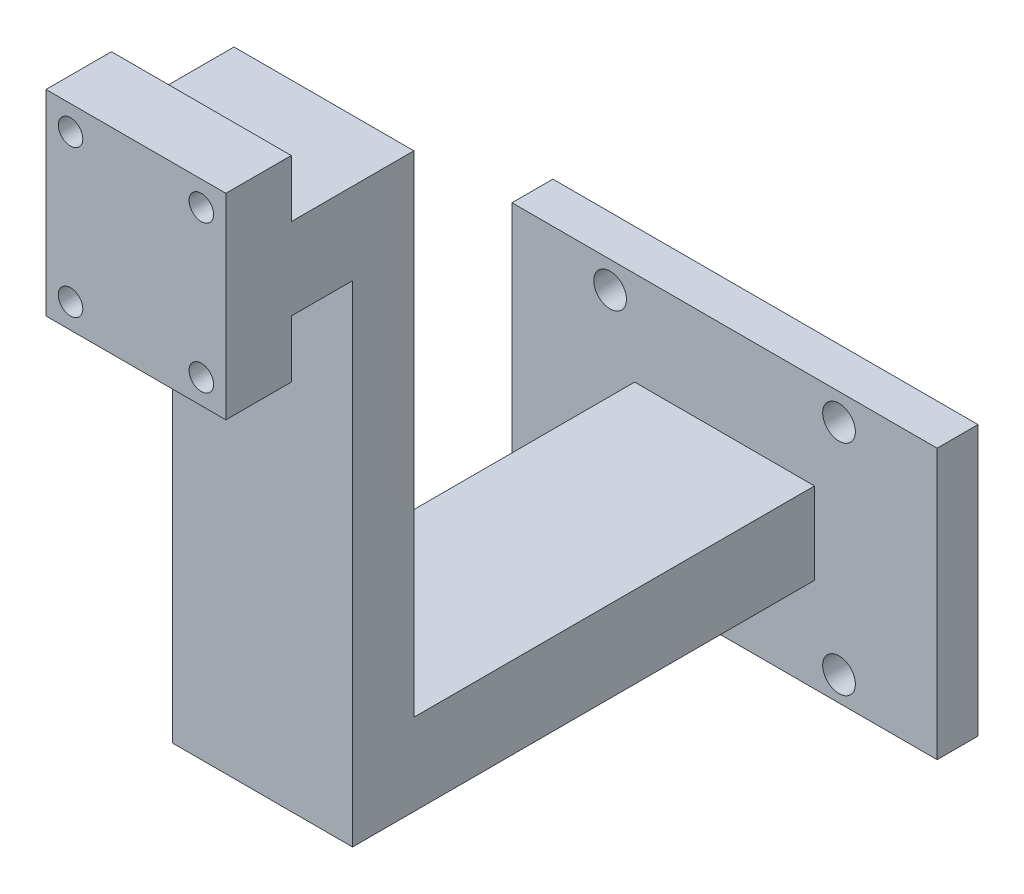
ISO-10303-21;
HEADER;
FILE_DESCRIPTION(('STEP AP214'),'2;1');
FILE_NAME('part.step','',(''),(''),'','','');
FILE_SCHEMA(('AUTOMOTIVE_DESIGN { 1 0 10303 214 1 1 1 1 }'));
ENDSEC;
DATA;
#1=APPLICATION_CONTEXT('core data for automotive mechanical design processes');
#2=APPLICATION_PROTOCOL_DEFINITION('international standard','automotive_design',2000,#1);
#3=PRODUCT_CONTEXT('',#1,'mechanical');
#4=PRODUCT('Part','Part','',(#3));
#5=PRODUCT_RELATED_PRODUCT_CATEGORY('part','',(#4));
#6=PRODUCT_DEFINITION_FORMATION('','',#4);
#7=PRODUCT_DEFINITION_CONTEXT('part definition',#1,'design');
#8=PRODUCT_DEFINITION('design','',#6,#7);
#9=PRODUCT_DEFINITION_SHAPE('','',#8);
#10=(LENGTH_UNIT() NAMED_UNIT(*) SI_UNIT(.MILLI.,.METRE.));
#11=(NAMED_UNIT(*) PLANE_ANGLE_UNIT() SI_UNIT($,.RADIAN.));
#12=(NAMED_UNIT(*) SI_UNIT($,.STERADIAN.) SOLID_ANGLE_UNIT());
#13=UNCERTAINTY_MEASURE_WITH_UNIT(LENGTH_MEASURE(1.E-05),#10,'distance_accuracy_value','');
#14=(GEOMETRIC_REPRESENTATION_CONTEXT(3) GLOBAL_UNCERTAINTY_ASSIGNED_CONTEXT((#13)) GLOBAL_UNIT_ASSIGNED_CONTEXT((#10,
#11,#12)) REPRESENTATION_CONTEXT('',''));
#15=CARTESIAN_POINT('',(0.,0.,0.));
#16=DIRECTION('',(0.,0.,1.));
#17=DIRECTION('',(1.,0.,0.));
#18=AXIS2_PLACEMENT_3D('',#15,#16,#17);
#19=CARTESIAN_POINT('',(0.,0.,8.));
#20=DIRECTION('',(-1.,0.,0.));
#21=DIRECTION('',(0.,0.,1.));
#22=AXIS2_PLACEMENT_3D('',#19,#20,#21);
#23=PLANE('',#22);
#24=DIRECTION('',(0.,0.,1.));
#25=VECTOR('',#24,1.);
#26=CARTESIAN_POINT('',(0.,-43.,-69.));
#27=LINE('',#26,#25);
#28=CARTESIAN_POINT('',(0.,-43.,-64.));
#29=VERTEX_POINT('',#28);
#30=CARTESIAN_POINT('',(0.,-43.,-15.));
#31=VERTEX_POINT('',#30);
#32=EDGE_CURVE('E209',#29,#31,#27,.T.);
#33=ORIENTED_EDGE('',*,*,#32,.F.);
#34=DIRECTION('',(0.,-1.,0.));
#35=VECTOR('',#34,1.);
#36=CARTESIAN_POINT('',(0.,0.,-64.));
#37=LINE('',#36,#35);
#38=CARTESIAN_POINT('',(0.,-53.,-64.));
#39=VERTEX_POINT('',#38);
#40=EDGE_CURVE('E60',#29,#39,#37,.T.);
#41=ORIENTED_EDGE('',*,*,#40,.T.);
#42=DIRECTION('',(0.,0.,-1.));
#43=VECTOR('',#42,1.);
#44=CARTESIAN_POINT('',(0.,-53.,-15.));
#45=LINE('',#44,#43);
#46=CARTESIAN_POINT('',(0.,-53.,-7.5));
#47=VERTEX_POINT('',#46);
#48=EDGE_CURVE('E212',#47,#39,#45,.T.);
#49=ORIENTED_EDGE('',*,*,#48,.F.);
#50=DIRECTION('',(0.,1.,0.));
#51=VECTOR('',#50,1.);
#52=CARTESIAN_POINT('',(0.,-53.,-7.5));
#53=LINE('',#52,#51);
#54=CARTESIAN_POINT('',(0.,7.,-7.5));
#55=VERTEX_POINT('',#54);
#56=EDGE_CURVE('E218',#47,#55,#53,.T.);
#57=ORIENTED_EDGE('',*,*,#56,.T.);
#58=DIRECTION('',(0.,0.,1.));
#59=VECTOR('',#58,1.);
#60=CARTESIAN_POINT('',(0.,7.,-15.));
#61=LINE('',#60,#59);
#62=CARTESIAN_POINT('',(0.,7.,0.));
#63=VERTEX_POINT('',#62);
#64=EDGE_CURVE('E235',#55,#63,#61,.T.);
#65=ORIENTED_EDGE('',*,*,#64,.T.);
#66=DIRECTION('',(0.,1.,0.));
#67=VECTOR('',#66,1.);
#68=CARTESIAN_POINT('',(0.,0.,0.));
#69=LINE('',#68,#67);
#70=CARTESIAN_POINT('',(0.,0.,0.));
#71=VERTEX_POINT('',#70);
#72=EDGE_CURVE('E281',#71,#63,#69,.T.);
#73=ORIENTED_EDGE('',*,*,#72,.F.);
#74=DIRECTION('',(0.,0.,-1.));
#75=VECTOR('',#74,1.);
#76=CARTESIAN_POINT('',(0.,0.,8.));
#77=LINE('',#76,#75);
#78=CARTESIAN_POINT('',(0.,0.,8.));
#79=VERTEX_POINT('',#78);
#80=EDGE_CURVE('E45',#79,#71,#77,.T.);
#81=ORIENTED_EDGE('',*,*,#80,.F.);
#82=DIRECTION('',(0.,1.,0.));
#83=VECTOR('',#82,1.);
#84=CARTESIAN_POINT('',(0.,0.,8.));
#85=LINE('',#84,#83);
#86=CARTESIAN_POINT('',(0.,24.,8.));
#87=VERTEX_POINT('',#86);
#88=EDGE_CURVE('E257',#79,#87,#85,.T.);
#89=ORIENTED_EDGE('',*,*,#88,.T.);
#90=DIRECTION('',(0.,0.,-1.));
#91=VECTOR('',#90,1.);
#92=CARTESIAN_POINT('',(0.,24.,8.));
#93=LINE('',#92,#91);
#94=CARTESIAN_POINT('',(0.,24.,0.));
#95=VERTEX_POINT('',#94);
#96=EDGE_CURVE('E274',#87,#95,#93,.T.);
#97=ORIENTED_EDGE('',*,*,#96,.T.);
#98=CARTESIAN_POINT('',(0.,17.,0.));
#99=VERTEX_POINT('',#98);
#100=EDGE_CURVE('E280',#99,#95,#69,.T.);
#101=ORIENTED_EDGE('',*,*,#100,.F.);
#102=DIRECTION('',(0.,0.,1.));
#103=VECTOR('',#102,1.);
#104=CARTESIAN_POINT('',(0.,17.,-15.));
#105=LINE('',#104,#103);
#106=CARTESIAN_POINT('',(0.,17.,-15.));
#107=VERTEX_POINT('',#106);
#108=EDGE_CURVE('E240',#107,#99,#105,.T.);
#109=ORIENTED_EDGE('',*,*,#108,.F.);
#110=DIRECTION('',(0.,1.,0.));
#111=VECTOR('',#110,1.);
#112=CARTESIAN_POINT('',(0.,0.,-15.));
#113=LINE('',#112,#111);
#114=EDGE_CURVE('E227',#31,#107,#113,.T.);
#115=ORIENTED_EDGE('',*,*,#114,.F.);
#116=EDGE_LOOP('',(#33,#41,#49,#57,#65,#73,#81,#89,#97,#101,#109,#115));
#117=FACE_BOUND('',#116,.T.);
#118=ADVANCED_FACE('F37',(#117),#23,.T.);
#119=CARTESIAN_POINT('',(22.,0.,8.));
#120=DIRECTION('',(-1.,0.,0.));
#121=DIRECTION('',(0.,0.,1.));
#122=AXIS2_PLACEMENT_3D('',#119,#120,#121);
#123=PLANE('',#122);
#124=DIRECTION('',(0.,-1.,0.));
#125=VECTOR('',#124,1.);
#126=CARTESIAN_POINT('',(22.,0.,-64.));
#127=LINE('',#126,#125);
#128=CARTESIAN_POINT('',(22.,-43.,-64.));
#129=VERTEX_POINT('',#128);
#130=CARTESIAN_POINT('',(22.,-53.,-64.));
#131=VERTEX_POINT('',#130);
#132=EDGE_CURVE('E196',#129,#131,#127,.T.);
#133=ORIENTED_EDGE('',*,*,#132,.F.);
#134=DIRECTION('',(0.,0.,1.));
#135=VECTOR('',#134,1.);
#136=CARTESIAN_POINT('',(22.,-43.,-69.));
#137=LINE('',#136,#135);
#138=CARTESIAN_POINT('',(22.,-43.,-15.));
#139=VERTEX_POINT('',#138);
#140=EDGE_CURVE('E207',#129,#139,#137,.T.);
#141=ORIENTED_EDGE('',*,*,#140,.T.);
#142=DIRECTION('',(0.,1.,0.));
#143=VECTOR('',#142,1.);
#144=CARTESIAN_POINT('',(22.,0.,-15.));
#145=LINE('',#144,#143);
#146=CARTESIAN_POINT('',(22.,17.,-15.));
#147=VERTEX_POINT('',#146);
#148=EDGE_CURVE('E229',#139,#147,#145,.T.);
#149=ORIENTED_EDGE('',*,*,#148,.T.);
#150=DIRECTION('',(0.,0.,1.));
#151=VECTOR('',#150,1.);
#152=CARTESIAN_POINT('',(22.,17.,-15.));
#153=LINE('',#152,#151);
#154=CARTESIAN_POINT('',(22.,17.,0.));
#155=VERTEX_POINT('',#154);
#156=EDGE_CURVE('E244',#147,#155,#153,.T.);
#157=ORIENTED_EDGE('',*,*,#156,.T.);
#158=DIRECTION('',(0.,1.,0.));
#159=VECTOR('',#158,1.);
#160=CARTESIAN_POINT('',(22.,0.,0.));
#161=LINE('',#160,#159);
#162=CARTESIAN_POINT('',(22.,24.,0.));
#163=VERTEX_POINT('',#162);
#164=EDGE_CURVE('E287',#155,#163,#161,.T.);
#165=ORIENTED_EDGE('',*,*,#164,.T.);
#166=DIRECTION('',(0.,0.,-1.));
#167=VECTOR('',#166,1.);
#168=CARTESIAN_POINT('',(22.,24.,8.));
#169=LINE('',#168,#167);
#170=CARTESIAN_POINT('',(22.,24.,8.));
#171=VERTEX_POINT('',#170);
#172=EDGE_CURVE('E301',#171,#163,#169,.T.);
#173=ORIENTED_EDGE('',*,*,#172,.F.);
#174=DIRECTION('',(0.,1.,0.));
#175=VECTOR('',#174,1.);
#176=CARTESIAN_POINT('',(22.,0.,8.));
#177=LINE('',#176,#175);
#178=CARTESIAN_POINT('',(22.,0.,8.));
#179=VERTEX_POINT('',#178);
#180=EDGE_CURVE('E263',#179,#171,#177,.T.);
#181=ORIENTED_EDGE('',*,*,#180,.F.);
#182=DIRECTION('',(0.,0.,-1.));
#183=VECTOR('',#182,1.);
#184=CARTESIAN_POINT('',(22.,0.,8.));
#185=LINE('',#184,#183);
#186=CARTESIAN_POINT('',(22.,0.,0.));
#187=VERTEX_POINT('',#186);
#188=EDGE_CURVE('E304',#179,#187,#185,.T.);
#189=ORIENTED_EDGE('',*,*,#188,.T.);
#190=CARTESIAN_POINT('',(22.,7.,0.));
#191=VERTEX_POINT('',#190);
#192=EDGE_CURVE('E288',#187,#191,#161,.T.);
#193=ORIENTED_EDGE('',*,*,#192,.T.);
#194=DIRECTION('',(0.,0.,1.));
#195=VECTOR('',#194,1.);
#196=CARTESIAN_POINT('',(22.,7.,-15.));
#197=LINE('',#196,#195);
#198=CARTESIAN_POINT('',(22.,7.,-7.5));
#199=VERTEX_POINT('',#198);
#200=EDGE_CURVE('E247',#199,#191,#197,.T.);
#201=ORIENTED_EDGE('',*,*,#200,.F.);
#202=DIRECTION('',(0.,1.,0.));
#203=VECTOR('',#202,1.);
#204=CARTESIAN_POINT('',(22.,-53.,-7.5));
#205=LINE('',#204,#203);
#206=CARTESIAN_POINT('',(22.,-53.,-7.5));
#207=VERTEX_POINT('',#206);
#208=EDGE_CURVE('E223',#207,#199,#205,.T.);
#209=ORIENTED_EDGE('',*,*,#208,.F.);
#210=DIRECTION('',(0.,0.,1.));
#211=VECTOR('',#210,1.);
#212=CARTESIAN_POINT('',(22.,-53.,-15.));
#213=LINE('',#212,#211);
#214=EDGE_CURVE('E214',#131,#207,#213,.T.);
#215=ORIENTED_EDGE('',*,*,#214,.F.);
#216=EDGE_LOOP('',(#133,#141,#149,#157,#165,#173,#181,#189,#193,#201,#209,#215));
#217=FACE_BOUND('',#216,.T.);
#218=ADVANCED_FACE('F327',(#217),#123,.F.);
#219=CARTESIAN_POINT('',(0.,-53.,0.));
#220=DIRECTION('',(0.,1.,0.));
#221=DIRECTION('',(0.,0.,1.));
#222=AXIS2_PLACEMENT_3D('',#219,#220,#221);
#223=PLANE('',#222);
#224=DIRECTION('',(-1.,0.,0.));
#225=VECTOR('',#224,1.);
#226=CARTESIAN_POINT('',(0.,-53.,-64.));
#227=LINE('',#226,#225);
#228=EDGE_CURVE('E52',#131,#39,#227,.T.);
#229=ORIENTED_EDGE('',*,*,#228,.F.);
#230=ORIENTED_EDGE('',*,*,#214,.T.);
#231=DIRECTION('',(-1.,0.,0.));
#232=VECTOR('',#231,1.);
#233=CARTESIAN_POINT('',(0.,-53.,-7.5));
#234=LINE('',#233,#232);
#235=EDGE_CURVE('E216',#207,#47,#234,.T.);
#236=ORIENTED_EDGE('',*,*,#235,.T.);
#237=ORIENTED_EDGE('',*,*,#48,.T.);
#238=EDGE_LOOP('',(#229,#230,#236,#237));
#239=FACE_BOUND('',#238,.T.);
#240=ADVANCED_FACE('F370',(#239),#223,.F.);
#241=CARTESIAN_POINT('',(22.,-43.,-69.));
#242=DIRECTION('',(0.,-1.,0.));
#243=DIRECTION('',(0.,0.,-1.));
#244=AXIS2_PLACEMENT_3D('',#241,#242,#243);
#245=PLANE('',#244);
#246=DIRECTION('',(1.,0.,0.));
#247=VECTOR('',#246,1.);
#248=CARTESIAN_POINT('',(22.,-43.,-64.));
#249=LINE('',#248,#247);
#250=EDGE_CURVE('E11',#29,#129,#249,.T.);
#251=ORIENTED_EDGE('',*,*,#250,.F.);
#252=ORIENTED_EDGE('',*,*,#32,.T.);
#253=DIRECTION('',(1.,0.,0.));
#254=VECTOR('',#253,1.);
#255=CARTESIAN_POINT('',(22.,-43.,-15.));
#256=LINE('',#255,#254);
#257=EDGE_CURVE('E204',#31,#139,#256,.T.);
#258=ORIENTED_EDGE('',*,*,#257,.T.);
#259=ORIENTED_EDGE('',*,*,#140,.F.);
#260=EDGE_LOOP('',(#251,#252,#258,#259));
#261=FACE_BOUND('',#260,.T.);
#262=ADVANCED_FACE('F350',(#261),#245,.F.);
#263=CARTESIAN_POINT('',(0.,0.,-15.));
#264=DIRECTION('',(0.,0.,1.));
#265=DIRECTION('',(1.,0.,0.));
#266=AXIS2_PLACEMENT_3D('',#263,#264,#265);
#267=PLANE('',#266);
#268=ORIENTED_EDGE('',*,*,#257,.F.);
#269=ORIENTED_EDGE('',*,*,#114,.T.);
#270=DIRECTION('',(1.,0.,0.));
#271=VECTOR('',#270,1.);
#272=CARTESIAN_POINT('',(0.,17.,-15.));
#273=LINE('',#272,#271);
#274=EDGE_CURVE('E232',#107,#147,#273,.T.);
#275=ORIENTED_EDGE('',*,*,#274,.T.);
#276=ORIENTED_EDGE('',*,*,#148,.F.);
#277=EDGE_LOOP('',(#268,#269,#275,#276));
#278=FACE_BOUND('',#277,.T.);
#279=ADVANCED_FACE('F347',(#278),#267,.F.);
#280=CARTESIAN_POINT('',(0.,7.,-15.));
#281=DIRECTION('',(0.,-1.,0.));
#282=DIRECTION('',(0.,0.,-1.));
#283=AXIS2_PLACEMENT_3D('',#280,#281,#282);
#284=PLANE('',#283);
#285=ORIENTED_EDGE('',*,*,#64,.F.);
#286=DIRECTION('',(-1.,0.,0.));
#287=VECTOR('',#286,1.);
#288=CARTESIAN_POINT('',(0.,7.,-7.5));
#289=LINE('',#288,#287);
#290=EDGE_CURVE('E211',#199,#55,#289,.T.);
#291=ORIENTED_EDGE('',*,*,#290,.F.);
#292=ORIENTED_EDGE('',*,*,#200,.T.);
#293=DIRECTION('',(1.,0.,0.));
#294=VECTOR('',#293,1.);
#295=CARTESIAN_POINT('',(0.,7.,0.));
#296=LINE('',#295,#294);
#297=EDGE_CURVE('E226',#63,#191,#296,.T.);
#298=ORIENTED_EDGE('',*,*,#297,.F.);
#299=EDGE_LOOP('',(#285,#291,#292,#298));
#300=FACE_BOUND('',#299,.T.);
#301=ADVANCED_FACE('F319',(#300),#284,.T.);
#302=CARTESIAN_POINT('',(0.,0.,0.));
#303=DIRECTION('',(0.,0.,1.));
#304=DIRECTION('',(1.,0.,0.));
#305=AXIS2_PLACEMENT_3D('',#302,#303,#304);
#306=PLANE('',#305);
#307=CARTESIAN_POINT('',(3.,21.,0.));
#308=DIRECTION('',(0.,0.,1.));
#309=DIRECTION('',(1.,0.,0.));
#310=AXIS2_PLACEMENT_3D('',#307,#308,#309);
#311=CIRCLE('',#310,1.5);
#312=CARTESIAN_POINT('',(4.5,21.,0.));
#313=VERTEX_POINT('',#312);
#314=EDGE_CURVE('E277',#313,#313,#311,.T.);
#315=ORIENTED_EDGE('',*,*,#314,.T.);
#316=EDGE_LOOP('',(#315));
#317=FACE_BOUND('',#316,.T.);
#318=CARTESIAN_POINT('',(19.,21.,0.));
#319=DIRECTION('',(0.,0.,1.));
#320=DIRECTION('',(1.,0.,0.));
#321=AXIS2_PLACEMENT_3D('',#318,#319,#320);
#322=CIRCLE('',#321,1.5);
#323=CARTESIAN_POINT('',(20.5,21.,0.));
#324=VERTEX_POINT('',#323);
#325=EDGE_CURVE('E243',#324,#324,#322,.T.);
#326=ORIENTED_EDGE('',*,*,#325,.T.);
#327=EDGE_LOOP('',(#326));
#328=FACE_BOUND('',#327,.T.);
#329=DIRECTION('',(1.,0.,0.));
#330=VECTOR('',#329,1.);
#331=CARTESIAN_POINT('',(0.,17.,0.));
#332=LINE('',#331,#330);
#333=EDGE_CURVE('E230',#99,#155,#332,.T.);
#334=ORIENTED_EDGE('',*,*,#333,.F.);
#335=ORIENTED_EDGE('',*,*,#100,.T.);
#336=DIRECTION('',(1.,0.,0.));
#337=VECTOR('',#336,1.);
#338=CARTESIAN_POINT('',(0.,24.,0.));
#339=LINE('',#338,#337);
#340=EDGE_CURVE('E291',#95,#163,#339,.T.);
#341=ORIENTED_EDGE('',*,*,#340,.T.);
#342=ORIENTED_EDGE('',*,*,#164,.F.);
#343=EDGE_LOOP('',(#334,#335,#341,#342));
#344=FACE_BOUND('',#343,.T.);
#345=ADVANCED_FACE('F339',(#317,#328,#344),#306,.F.);
#346=CARTESIAN_POINT('',(0.,0.,8.));
#347=DIRECTION('',(0.,1.,0.));
#348=DIRECTION('',(0.,0.,1.));
#349=AXIS2_PLACEMENT_3D('',#346,#347,#348);
#350=PLANE('',#349);
#351=DIRECTION('',(1.,0.,0.));
#352=VECTOR('',#351,1.);
#353=CARTESIAN_POINT('',(0.,0.,0.));
#354=LINE('',#353,#352);
#355=EDGE_CURVE('E284',#71,#187,#354,.T.);
#356=ORIENTED_EDGE('',*,*,#355,.T.);
#357=ORIENTED_EDGE('',*,*,#188,.F.);
#358=DIRECTION('',(1.,0.,0.));
#359=VECTOR('',#358,1.);
#360=CARTESIAN_POINT('',(0.,0.,8.));
#361=LINE('',#360,#359);
#362=EDGE_CURVE('E260',#79,#179,#361,.T.);
#363=ORIENTED_EDGE('',*,*,#362,.F.);
#364=ORIENTED_EDGE('',*,*,#80,.T.);
#365=EDGE_LOOP('',(#356,#357,#363,#364));
#366=FACE_BOUND('',#365,.T.);
#367=ADVANCED_FACE('F309',(#366),#350,.F.);
#368=CARTESIAN_POINT('',(3.00000000000019,3.,8.));
#369=DIRECTION('',(0.,0.,-1.));
#370=DIRECTION('',(-1.,0.,0.));
#371=AXIS2_PLACEMENT_3D('',#368,#369,#370);
#372=CYLINDRICAL_SURFACE('',#371,1.5);
#373=CARTESIAN_POINT('',(3.00000000000019,3.,8.));
#374=DIRECTION('',(0.,0.,1.));
#375=DIRECTION('',(1.,0.,0.));
#376=AXIS2_PLACEMENT_3D('',#373,#374,#375);
#377=CIRCLE('',#376,1.5);
#378=CARTESIAN_POINT('',(4.50000000000019,3.,8.));
#379=VERTEX_POINT('',#378);
#380=EDGE_CURVE('E268',#379,#379,#377,.T.);
#381=ORIENTED_EDGE('',*,*,#380,.T.);
#382=EDGE_LOOP('',(#381));
#383=FACE_BOUND('',#382,.T.);
#384=CARTESIAN_POINT('',(3.00000000000019,3.,0.));
#385=DIRECTION('',(0.,0.,1.));
#386=DIRECTION('',(1.,0.,0.));
#387=AXIS2_PLACEMENT_3D('',#384,#385,#386);
#388=CIRCLE('',#387,1.5);
#389=CARTESIAN_POINT('',(4.50000000000019,3.,0.));
#390=VERTEX_POINT('',#389);
#391=EDGE_CURVE('E294',#390,#390,#388,.T.);
#392=ORIENTED_EDGE('',*,*,#391,.F.);
#393=EDGE_LOOP('',(#392));
#394=FACE_BOUND('',#393,.T.);
#395=ADVANCED_FACE('F382',(#383,#394),#372,.F.);
#396=CARTESIAN_POINT('',(0.,24.,8.));
#397=DIRECTION('',(0.,1.,0.));
#398=DIRECTION('',(0.,0.,1.));
#399=AXIS2_PLACEMENT_3D('',#396,#397,#398);
#400=PLANE('',#399);
#401=ORIENTED_EDGE('',*,*,#340,.F.);
#402=ORIENTED_EDGE('',*,*,#96,.F.);
#403=DIRECTION('',(1.,0.,0.));
#404=VECTOR('',#403,1.);
#405=CARTESIAN_POINT('',(0.,24.,8.));
#406=LINE('',#405,#404);
#407=EDGE_CURVE('E265',#87,#171,#406,.T.);
#408=ORIENTED_EDGE('',*,*,#407,.T.);
#409=ORIENTED_EDGE('',*,*,#172,.T.);
#410=EDGE_LOOP('',(#401,#402,#408,#409));
#411=FACE_BOUND('',#410,.T.);
#412=ADVANCED_FACE('F337',(#411),#400,.T.);
#413=CARTESIAN_POINT('',(3.,21.,8.));
#414=DIRECTION('',(0.,0.,-1.));
#415=DIRECTION('',(-1.,0.,0.));
#416=AXIS2_PLACEMENT_3D('',#413,#414,#415);
#417=CYLINDRICAL_SURFACE('',#416,1.5);
#418=CARTESIAN_POINT('',(3.,21.,8.));
#419=DIRECTION('',(0.,0.,1.));
#420=DIRECTION('',(1.,0.,0.));
#421=AXIS2_PLACEMENT_3D('',#418,#419,#420);
#422=CIRCLE('',#421,1.5);
#423=CARTESIAN_POINT('',(4.5,21.,8.));
#424=VERTEX_POINT('',#423);
#425=EDGE_CURVE('E253',#424,#424,#422,.T.);
#426=ORIENTED_EDGE('',*,*,#425,.T.);
#427=EDGE_LOOP('',(#426));
#428=FACE_BOUND('',#427,.T.);
#429=ORIENTED_EDGE('',*,*,#314,.F.);
#430=EDGE_LOOP('',(#429));
#431=FACE_BOUND('',#430,.T.);
#432=ADVANCED_FACE('F373',(#428,#431),#417,.F.);
#433=CARTESIAN_POINT('',(19.,21.,8.));
#434=DIRECTION('',(0.,0.,-1.));
#435=DIRECTION('',(-1.,0.,0.));
#436=AXIS2_PLACEMENT_3D('',#433,#434,#435);
#437=CYLINDRICAL_SURFACE('',#436,1.5);
#438=CARTESIAN_POINT('',(19.,21.,8.));
#439=DIRECTION('',(0.,0.,1.));
#440=DIRECTION('',(1.,0.,0.));
#441=AXIS2_PLACEMENT_3D('',#438,#439,#440);
#442=CIRCLE('',#441,1.5);
#443=CARTESIAN_POINT('',(20.5,21.,8.));
#444=VERTEX_POINT('',#443);
#445=EDGE_CURVE('E250',#444,#444,#442,.T.);
#446=ORIENTED_EDGE('',*,*,#445,.T.);
#447=EDGE_LOOP('',(#446));
#448=FACE_BOUND('',#447,.T.);
#449=ORIENTED_EDGE('',*,*,#325,.F.);
#450=EDGE_LOOP('',(#449));
#451=FACE_BOUND('',#450,.T.);
#452=ADVANCED_FACE('F39',(#448,#451),#437,.F.);
#453=CARTESIAN_POINT('',(19.0000000000002,3.,8.));
#454=DIRECTION('',(0.,0.,-1.));
#455=DIRECTION('',(-1.,0.,0.));
#456=AXIS2_PLACEMENT_3D('',#453,#454,#455);
#457=CYLINDRICAL_SURFACE('',#456,1.5);
#458=CARTESIAN_POINT('',(19.0000000000002,3.,8.));
#459=DIRECTION('',(0.,0.,1.));
#460=DIRECTION('',(1.,0.,0.));
#461=AXIS2_PLACEMENT_3D('',#458,#459,#460);
#462=CIRCLE('',#461,1.5);
#463=CARTESIAN_POINT('',(20.5000000000002,3.,8.));
#464=VERTEX_POINT('',#463);
#465=EDGE_CURVE('E271',#464,#464,#462,.T.);
#466=ORIENTED_EDGE('',*,*,#465,.T.);
#467=EDGE_LOOP('',(#466));
#468=FACE_BOUND('',#467,.T.);
#469=CARTESIAN_POINT('',(19.0000000000002,3.,0.));
#470=DIRECTION('',(0.,0.,1.));
#471=DIRECTION('',(1.,0.,0.));
#472=AXIS2_PLACEMENT_3D('',#469,#470,#471);
#473=CIRCLE('',#472,1.5);
#474=CARTESIAN_POINT('',(20.5000000000002,3.,0.));
#475=VERTEX_POINT('',#474);
#476=EDGE_CURVE('E254',#475,#475,#473,.T.);
#477=ORIENTED_EDGE('',*,*,#476,.F.);
#478=EDGE_LOOP('',(#477));
#479=FACE_BOUND('',#478,.T.);
#480=ADVANCED_FACE('F380',(#468,#479),#457,.F.);
#481=CARTESIAN_POINT('',(0.,0.,8.));
#482=DIRECTION('',(0.,0.,1.));
#483=DIRECTION('',(1.,0.,0.));
#484=AXIS2_PLACEMENT_3D('',#481,#482,#483);
#485=PLANE('',#484);
#486=ORIENTED_EDGE('',*,*,#445,.F.);
#487=EDGE_LOOP('',(#486));
#488=FACE_BOUND('',#487,.T.);
#489=ORIENTED_EDGE('',*,*,#425,.F.);
#490=EDGE_LOOP('',(#489));
#491=FACE_BOUND('',#490,.T.);
#492=ORIENTED_EDGE('',*,*,#88,.F.);
#493=ORIENTED_EDGE('',*,*,#362,.T.);
#494=ORIENTED_EDGE('',*,*,#180,.T.);
#495=ORIENTED_EDGE('',*,*,#407,.F.);
#496=EDGE_LOOP('',(#492,#493,#494,#495));
#497=FACE_BOUND('',#496,.T.);
#498=ORIENTED_EDGE('',*,*,#380,.F.);
#499=EDGE_LOOP('',(#498));
#500=FACE_BOUND('',#499,.T.);
#501=ORIENTED_EDGE('',*,*,#465,.F.);
#502=EDGE_LOOP('',(#501));
#503=FACE_BOUND('',#502,.T.);
#504=ADVANCED_FACE('F331',(#488,#491,#497,#500,#503),#485,.T.);
#505=ORIENTED_EDGE('',*,*,#72,.T.);
#506=ORIENTED_EDGE('',*,*,#297,.T.);
#507=ORIENTED_EDGE('',*,*,#192,.F.);
#508=ORIENTED_EDGE('',*,*,#355,.F.);
#509=EDGE_LOOP('',(#505,#506,#507,#508));
#510=FACE_BOUND('',#509,.T.);
#511=ORIENTED_EDGE('',*,*,#391,.T.);
#512=EDGE_LOOP('',(#511));
#513=FACE_BOUND('',#512,.T.);
#514=ORIENTED_EDGE('',*,*,#476,.T.);
#515=EDGE_LOOP('',(#514));
#516=FACE_BOUND('',#515,.T.);
#517=ADVANCED_FACE('F314',(#510,#513,#516),#306,.F.);
#518=CARTESIAN_POINT('',(0.,17.,-15.));
#519=DIRECTION('',(0.,-1.,0.));
#520=DIRECTION('',(0.,0.,-1.));
#521=AXIS2_PLACEMENT_3D('',#518,#519,#520);
#522=PLANE('',#521);
#523=ORIENTED_EDGE('',*,*,#333,.T.);
#524=ORIENTED_EDGE('',*,*,#156,.F.);
#525=ORIENTED_EDGE('',*,*,#274,.F.);
#526=ORIENTED_EDGE('',*,*,#108,.T.);
#527=EDGE_LOOP('',(#523,#524,#525,#526));
#528=FACE_BOUND('',#527,.T.);
#529=ADVANCED_FACE('F342',(#528),#522,.F.);
#530=CARTESIAN_POINT('',(0.,-53.,-7.5));
#531=DIRECTION('',(0.,0.,-1.));
#532=DIRECTION('',(-1.,0.,0.));
#533=AXIS2_PLACEMENT_3D('',#530,#531,#532);
#534=PLANE('',#533);
#535=ORIENTED_EDGE('',*,*,#290,.T.);
#536=ORIENTED_EDGE('',*,*,#56,.F.);
#537=ORIENTED_EDGE('',*,*,#235,.F.);
#538=ORIENTED_EDGE('',*,*,#208,.T.);
#539=EDGE_LOOP('',(#535,#536,#537,#538));
#540=FACE_BOUND('',#539,.T.);
#541=ADVANCED_FACE('F322',(#540),#534,.F.);
#542=CARTESIAN_POINT('',(0.,0.,-64.));
#543=DIRECTION('',(0.,0.,-1.));
#544=DIRECTION('',(-1.,0.,0.));
#545=AXIS2_PLACEMENT_3D('',#542,#543,#544);
#546=PLANE('',#545);
#547=CARTESIAN_POINT('',(25.,-61.5,-64.));
#548=DIRECTION('',(0.,0.,-1.));
#549=DIRECTION('',(-1.,0.,0.));
#550=AXIS2_PLACEMENT_3D('',#547,#548,#549);
#551=CIRCLE('',#550,2.);
#552=CARTESIAN_POINT('',(23.,-61.5,-64.));
#553=VERTEX_POINT('',#552);
#554=EDGE_CURVE('E669',#553,#553,#551,.T.);
#555=ORIENTED_EDGE('',*,*,#554,.T.);
#556=EDGE_LOOP('',(#555));
#557=FACE_BOUND('',#556,.T.);
#558=CARTESIAN_POINT('',(-3.00000000000001,-34.75,-64.));
#559=DIRECTION('',(0.,0.,-1.));
#560=DIRECTION('',(-1.,0.,0.));
#561=AXIS2_PLACEMENT_3D('',#558,#559,#560);
#562=CIRCLE('',#561,2.);
#563=CARTESIAN_POINT('',(-5.00000000000002,-34.75,-64.));
#564=VERTEX_POINT('',#563);
#565=EDGE_CURVE('E673',#564,#564,#562,.T.);
#566=ORIENTED_EDGE('',*,*,#565,.T.);
#567=EDGE_LOOP('',(#566));
#568=FACE_BOUND('',#567,.T.);
#569=CARTESIAN_POINT('',(-3.00000000000002,-61.5,-64.));
#570=DIRECTION('',(0.,0.,-1.));
#571=DIRECTION('',(-1.,0.,0.));
#572=AXIS2_PLACEMENT_3D('',#569,#570,#571);
#573=CIRCLE('',#572,2.);
#574=CARTESIAN_POINT('',(-5.00000000000002,-61.5,-64.));
#575=VERTEX_POINT('',#574);
#576=EDGE_CURVE('E682',#575,#575,#573,.T.);
#577=ORIENTED_EDGE('',*,*,#576,.T.);
#578=EDGE_LOOP('',(#577));
#579=FACE_BOUND('',#578,.T.);
#580=CARTESIAN_POINT('',(25.,-34.75,-64.));
#581=DIRECTION('',(0.,0.,-1.));
#582=DIRECTION('',(-1.,0.,0.));
#583=AXIS2_PLACEMENT_3D('',#580,#581,#582);
#584=CIRCLE('',#583,2.);
#585=CARTESIAN_POINT('',(23.,-34.75,-64.));
#586=VERTEX_POINT('',#585);
#587=EDGE_CURVE('E191',#586,#586,#584,.T.);
#588=ORIENTED_EDGE('',*,*,#587,.T.);
#589=EDGE_LOOP('',(#588));
#590=FACE_BOUND('',#589,.T.);
#591=DIRECTION('',(0.,-1.,0.));
#592=VECTOR('',#591,1.);
#593=CARTESIAN_POINT('',(37.,-31.5,-64.));
#594=LINE('',#593,#592);
#595=CARTESIAN_POINT('',(37.,-31.5,-64.));
#596=VERTEX_POINT('',#595);
#597=CARTESIAN_POINT('',(37.,-64.5,-64.));
#598=VERTEX_POINT('',#597);
#599=EDGE_CURVE('E171',#596,#598,#594,.T.);
#600=ORIENTED_EDGE('',*,*,#599,.F.);
#601=DIRECTION('',(1.,0.,0.));
#602=VECTOR('',#601,1.);
#603=CARTESIAN_POINT('',(37.,-31.5,-64.));
#604=LINE('',#603,#602);
#605=CARTESIAN_POINT('',(-15.,-31.5,-64.));
#606=VERTEX_POINT('',#605);
#607=EDGE_CURVE('E163',#606,#596,#604,.T.);
#608=ORIENTED_EDGE('',*,*,#607,.F.);
#609=DIRECTION('',(0.,1.,0.));
#610=VECTOR('',#609,1.);
#611=CARTESIAN_POINT('',(-15.,-31.5,-64.));
#612=LINE('',#611,#610);
#613=CARTESIAN_POINT('',(-15.,-64.5,-64.));
#614=VERTEX_POINT('',#613);
#615=EDGE_CURVE('E174',#614,#606,#612,.T.);
#616=ORIENTED_EDGE('',*,*,#615,.F.);
#617=DIRECTION('',(-1.,0.,0.));
#618=VECTOR('',#617,1.);
#619=CARTESIAN_POINT('',(37.,-64.5,-64.));
#620=LINE('',#619,#618);
#621=EDGE_CURVE('E155',#598,#614,#620,.T.);
#622=ORIENTED_EDGE('',*,*,#621,.F.);
#623=EDGE_LOOP('',(#600,#608,#616,#622));
#624=FACE_BOUND('',#623,.T.);
#625=ORIENTED_EDGE('',*,*,#132,.T.);
#626=ORIENTED_EDGE('',*,*,#228,.T.);
#627=ORIENTED_EDGE('',*,*,#40,.F.);
#628=ORIENTED_EDGE('',*,*,#250,.T.);
#629=EDGE_LOOP('',(#625,#626,#627,#628));
#630=FACE_BOUND('',#629,.T.);
#631=ADVANCED_FACE('F168',(#557,#568,#579,#590,#624,#630),#546,.F.);
#632=CARTESIAN_POINT('',(37.,-31.5,-64.));
#633=DIRECTION('',(1.,0.,0.));
#634=DIRECTION('',(0.,1.,0.));
#635=AXIS2_PLACEMENT_3D('',#632,#633,#634);
#636=PLANE('',#635);
#637=DIRECTION('',(0.,-1.,0.));
#638=VECTOR('',#637,1.);
#639=CARTESIAN_POINT('',(37.,-31.5,-69.));
#640=LINE('',#639,#638);
#641=CARTESIAN_POINT('',(37.,-31.5,-69.));
#642=VERTEX_POINT('',#641);
#643=CARTESIAN_POINT('',(37.,-64.5,-69.));
#644=VERTEX_POINT('',#643);
#645=EDGE_CURVE('E189',#642,#644,#640,.T.);
#646=ORIENTED_EDGE('',*,*,#645,.F.);
#647=DIRECTION('',(0.,0.,-1.));
#648=VECTOR('',#647,1.);
#649=CARTESIAN_POINT('',(37.,-31.5,-64.));
#650=LINE('',#649,#648);
#651=EDGE_CURVE('E177',#596,#642,#650,.T.);
#652=ORIENTED_EDGE('',*,*,#651,.F.);
#653=ORIENTED_EDGE('',*,*,#599,.T.);
#654=DIRECTION('',(0.,0.,-1.));
#655=VECTOR('',#654,1.);
#656=CARTESIAN_POINT('',(37.,-64.5,-64.));
#657=LINE('',#656,#655);
#658=EDGE_CURVE('E152',#598,#644,#657,.T.);
#659=ORIENTED_EDGE('',*,*,#658,.T.);
#660=EDGE_LOOP('',(#646,#652,#653,#659));
#661=FACE_BOUND('',#660,.T.);
#662=ADVANCED_FACE('F176',(#661),#636,.T.);
#663=CARTESIAN_POINT('',(37.,-31.5,-64.));
#664=DIRECTION('',(0.,1.,0.));
#665=DIRECTION('',(0.,0.,1.));
#666=AXIS2_PLACEMENT_3D('',#663,#664,#665);
#667=PLANE('',#666);
#668=DIRECTION('',(1.,0.,0.));
#669=VECTOR('',#668,1.);
#670=CARTESIAN_POINT('',(37.,-31.5,-69.));
#671=LINE('',#670,#669);
#672=CARTESIAN_POINT('',(-15.,-31.5,-69.));
#673=VERTEX_POINT('',#672);
#674=EDGE_CURVE('E178',#673,#642,#671,.T.);
#675=ORIENTED_EDGE('',*,*,#674,.F.);
#676=DIRECTION('',(0.,0.,-1.));
#677=VECTOR('',#676,1.);
#678=CARTESIAN_POINT('',(-15.,-31.5,-64.));
#679=LINE('',#678,#677);
#680=EDGE_CURVE('E197',#606,#673,#679,.T.);
#681=ORIENTED_EDGE('',*,*,#680,.F.);
#682=ORIENTED_EDGE('',*,*,#607,.T.);
#683=ORIENTED_EDGE('',*,*,#651,.T.);
#684=EDGE_LOOP('',(#675,#681,#682,#683));
#685=FACE_BOUND('',#684,.T.);
#686=ADVANCED_FACE('F358',(#685),#667,.T.);
#687=CARTESIAN_POINT('',(-15.,-31.5,-64.));
#688=DIRECTION('',(-1.,0.,0.));
#689=DIRECTION('',(0.,-1.,0.));
#690=AXIS2_PLACEMENT_3D('',#687,#688,#689);
#691=PLANE('',#690);
#692=DIRECTION('',(0.,1.,0.));
#693=VECTOR('',#692,1.);
#694=CARTESIAN_POINT('',(-15.,-31.5,-69.));
#695=LINE('',#694,#693);
#696=CARTESIAN_POINT('',(-15.,-64.5,-69.));
#697=VERTEX_POINT('',#696);
#698=EDGE_CURVE('E181',#697,#673,#695,.T.);
#699=ORIENTED_EDGE('',*,*,#698,.F.);
#700=DIRECTION('',(0.,0.,-1.));
#701=VECTOR('',#700,1.);
#702=CARTESIAN_POINT('',(-15.,-64.5,-64.));
#703=LINE('',#702,#701);
#704=EDGE_CURVE('E162',#614,#697,#703,.T.);
#705=ORIENTED_EDGE('',*,*,#704,.F.);
#706=ORIENTED_EDGE('',*,*,#615,.T.);
#707=ORIENTED_EDGE('',*,*,#680,.T.);
#708=EDGE_LOOP('',(#699,#705,#706,#707));
#709=FACE_BOUND('',#708,.T.);
#710=ADVANCED_FACE('F427',(#709),#691,.T.);
#711=CARTESIAN_POINT('',(37.,-64.5,-64.));
#712=DIRECTION('',(0.,-1.,0.));
#713=DIRECTION('',(0.,0.,-1.));
#714=AXIS2_PLACEMENT_3D('',#711,#712,#713);
#715=PLANE('',#714);
#716=DIRECTION('',(-1.,0.,0.));
#717=VECTOR('',#716,1.);
#718=CARTESIAN_POINT('',(37.,-64.5,-69.));
#719=LINE('',#718,#717);
#720=EDGE_CURVE('E157',#644,#697,#719,.T.);
#721=ORIENTED_EDGE('',*,*,#720,.F.);
#722=ORIENTED_EDGE('',*,*,#658,.F.);
#723=ORIENTED_EDGE('',*,*,#621,.T.);
#724=ORIENTED_EDGE('',*,*,#704,.T.);
#725=EDGE_LOOP('',(#721,#722,#723,#724));
#726=FACE_BOUND('',#725,.T.);
#727=ADVANCED_FACE('F154',(#726),#715,.T.);
#728=CARTESIAN_POINT('',(0.,0.,-69.));
#729=DIRECTION('',(0.,0.,1.));
#730=DIRECTION('',(1.,0.,0.));
#731=AXIS2_PLACEMENT_3D('',#728,#729,#730);
#732=PLANE('',#731);
#733=CARTESIAN_POINT('',(25.,-61.5,-69.));
#734=DIRECTION('',(0.,0.,-1.));
#735=DIRECTION('',(-1.,0.,0.));
#736=AXIS2_PLACEMENT_3D('',#733,#734,#735);
#737=CIRCLE('',#736,2.);
#738=CARTESIAN_POINT('',(23.,-61.5,-69.));
#739=VERTEX_POINT('',#738);
#740=EDGE_CURVE('E672',#739,#739,#737,.T.);
#741=ORIENTED_EDGE('',*,*,#740,.F.);
#742=EDGE_LOOP('',(#741));
#743=FACE_BOUND('',#742,.T.);
#744=CARTESIAN_POINT('',(-3.00000000000001,-34.75,-69.));
#745=DIRECTION('',(0.,0.,-1.));
#746=DIRECTION('',(-1.,0.,0.));
#747=AXIS2_PLACEMENT_3D('',#744,#745,#746);
#748=CIRCLE('',#747,2.);
#749=CARTESIAN_POINT('',(-5.00000000000002,-34.75,-69.));
#750=VERTEX_POINT('',#749);
#751=EDGE_CURVE('E677',#750,#750,#748,.T.);
#752=ORIENTED_EDGE('',*,*,#751,.F.);
#753=EDGE_LOOP('',(#752));
#754=FACE_BOUND('',#753,.T.);
#755=CARTESIAN_POINT('',(-3.00000000000002,-61.5,-69.));
#756=DIRECTION('',(0.,0.,-1.));
#757=DIRECTION('',(-1.,0.,0.));
#758=AXIS2_PLACEMENT_3D('',#755,#756,#757);
#759=CIRCLE('',#758,2.);
#760=CARTESIAN_POINT('',(-5.00000000000002,-61.5,-69.));
#761=VERTEX_POINT('',#760);
#762=EDGE_CURVE('E693',#761,#761,#759,.T.);
#763=ORIENTED_EDGE('',*,*,#762,.F.);
#764=EDGE_LOOP('',(#763));
#765=FACE_BOUND('',#764,.T.);
#766=CARTESIAN_POINT('',(25.,-34.75,-69.));
#767=DIRECTION('',(0.,0.,-1.));
#768=DIRECTION('',(-1.,0.,0.));
#769=AXIS2_PLACEMENT_3D('',#766,#767,#768);
#770=CIRCLE('',#769,2.);
#771=CARTESIAN_POINT('',(23.,-34.75,-69.));
#772=VERTEX_POINT('',#771);
#773=EDGE_CURVE('E184',#772,#772,#770,.T.);
#774=ORIENTED_EDGE('',*,*,#773,.F.);
#775=EDGE_LOOP('',(#774));
#776=FACE_BOUND('',#775,.T.);
#777=ORIENTED_EDGE('',*,*,#645,.T.);
#778=ORIENTED_EDGE('',*,*,#720,.T.);
#779=ORIENTED_EDGE('',*,*,#698,.T.);
#780=ORIENTED_EDGE('',*,*,#674,.T.);
#781=EDGE_LOOP('',(#777,#778,#779,#780));
#782=FACE_BOUND('',#781,.T.);
#783=ADVANCED_FACE('F420',(#743,#754,#765,#776,#782),#732,.F.);
#784=CARTESIAN_POINT('',(25.,-34.75,-64.));
#785=DIRECTION('',(0.,0.,-1.));
#786=DIRECTION('',(-1.,0.,0.));
#787=AXIS2_PLACEMENT_3D('',#784,#785,#786);
#788=CYLINDRICAL_SURFACE('',#787,2.);
#789=ORIENTED_EDGE('',*,*,#587,.F.);
#790=EDGE_LOOP('',(#789));
#791=FACE_BOUND('',#790,.T.);
#792=ORIENTED_EDGE('',*,*,#773,.T.);
#793=EDGE_LOOP('',(#792));
#794=FACE_BOUND('',#793,.T.);
#795=ADVANCED_FACE('F422',(#791,#794),#788,.F.);
#796=CARTESIAN_POINT('',(-3.00000000000002,-61.5,-64.));
#797=DIRECTION('',(0.,0.,-1.));
#798=DIRECTION('',(-1.,0.,0.));
#799=AXIS2_PLACEMENT_3D('',#796,#797,#798);
#800=CYLINDRICAL_SURFACE('',#799,2.);
#801=ORIENTED_EDGE('',*,*,#576,.F.);
#802=EDGE_LOOP('',(#801));
#803=FACE_BOUND('',#802,.T.);
#804=ORIENTED_EDGE('',*,*,#762,.T.);
#805=EDGE_LOOP('',(#804));
#806=FACE_BOUND('',#805,.T.);
#807=ADVANCED_FACE('F457',(#803,#806),#800,.F.);
#808=CARTESIAN_POINT('',(-3.00000000000001,-34.75,-64.));
#809=DIRECTION('',(0.,0.,-1.));
#810=DIRECTION('',(-1.,0.,0.));
#811=AXIS2_PLACEMENT_3D('',#808,#809,#810);
#812=CYLINDRICAL_SURFACE('',#811,2.);
#813=ORIENTED_EDGE('',*,*,#565,.F.);
#814=EDGE_LOOP('',(#813));
#815=FACE_BOUND('',#814,.T.);
#816=ORIENTED_EDGE('',*,*,#751,.T.);
#817=EDGE_LOOP('',(#816));
#818=FACE_BOUND('',#817,.T.);
#819=ADVANCED_FACE('F464',(#815,#818),#812,.F.);
#820=CARTESIAN_POINT('',(25.,-61.5,-64.));
#821=DIRECTION('',(0.,0.,-1.));
#822=DIRECTION('',(-1.,0.,0.));
#823=AXIS2_PLACEMENT_3D('',#820,#821,#822);
#824=CYLINDRICAL_SURFACE('',#823,2.);
#825=ORIENTED_EDGE('',*,*,#554,.F.);
#826=EDGE_LOOP('',(#825));
#827=FACE_BOUND('',#826,.T.);
#828=ORIENTED_EDGE('',*,*,#740,.T.);
#829=EDGE_LOOP('',(#828));
#830=FACE_BOUND('',#829,.T.);
#831=ADVANCED_FACE('F472',(#827,#830),#824,.F.);
#832=CLOSED_SHELL('',(#118,#218,#240,#262,#279,#301,#345,#367,#395,#412,#432,#452,#480,#504,
#517,#529,#541,#631,#662,#686,#710,#727,#783,#795,#807,#819,#831));
#833=MANIFOLD_SOLID_BREP('B2',#832);
#834=ADVANCED_BREP_SHAPE_REPRESENTATION('',(#18,#833),#14);
#835=SHAPE_DEFINITION_REPRESENTATION(#9,#834);
ENDSEC;
END-ISO-10303-21;
